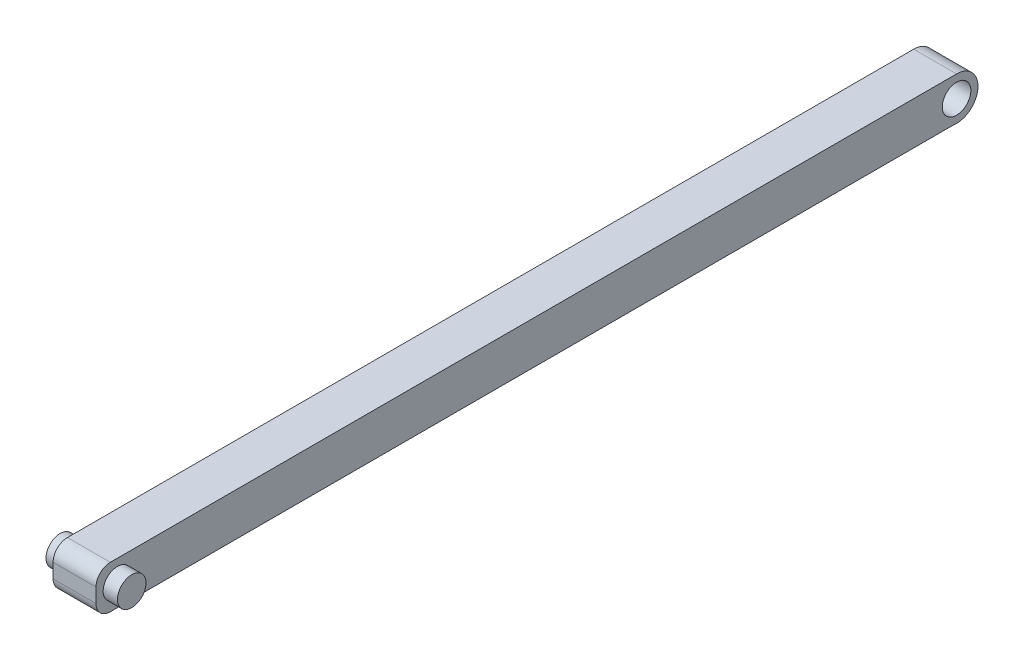
ISO-10303-21;
HEADER;
FILE_DESCRIPTION(('STEP AP214'),'2;1');
FILE_NAME('part.step','',(''),(''),'','','');
FILE_SCHEMA(('AUTOMOTIVE_DESIGN { 1 0 10303 214 1 1 1 1 }'));
ENDSEC;
DATA;
#1=APPLICATION_CONTEXT('core data for automotive mechanical design processes');
#2=APPLICATION_PROTOCOL_DEFINITION('international standard','automotive_design',2000,#1);
#3=PRODUCT_CONTEXT('',#1,'mechanical');
#4=PRODUCT('Part','Part','',(#3));
#5=PRODUCT_RELATED_PRODUCT_CATEGORY('part','',(#4));
#6=PRODUCT_DEFINITION_FORMATION('','',#4);
#7=PRODUCT_DEFINITION_CONTEXT('part definition',#1,'design');
#8=PRODUCT_DEFINITION('design','',#6,#7);
#9=PRODUCT_DEFINITION_SHAPE('','',#8);
#10=(LENGTH_UNIT() NAMED_UNIT(*) SI_UNIT(.MILLI.,.METRE.));
#11=(NAMED_UNIT(*) PLANE_ANGLE_UNIT() SI_UNIT($,.RADIAN.));
#12=(NAMED_UNIT(*) SI_UNIT($,.STERADIAN.) SOLID_ANGLE_UNIT());
#13=UNCERTAINTY_MEASURE_WITH_UNIT(LENGTH_MEASURE(1.E-05),#10,'distance_accuracy_value','');
#14=(GEOMETRIC_REPRESENTATION_CONTEXT(3) GLOBAL_UNCERTAINTY_ASSIGNED_CONTEXT((#13)) GLOBAL_UNIT_ASSIGNED_CONTEXT((#10,
#11,#12)) REPRESENTATION_CONTEXT('',''));
#15=CARTESIAN_POINT('',(0.,0.,0.));
#16=DIRECTION('',(0.,0.,1.));
#17=DIRECTION('',(1.,0.,0.));
#18=AXIS2_PLACEMENT_3D('',#15,#16,#17);
#19=CARTESIAN_POINT('',(15.,0.,-100.));
#20=DIRECTION('',(1.,0.,0.));
#21=DIRECTION('',(0.,0.,-1.));
#22=AXIS2_PLACEMENT_3D('',#19,#20,#21);
#23=PLANE('',#22);
#24=CARTESIAN_POINT('',(15.,0.0669810012814782,193.509068176166));
#25=DIRECTION('',(1.,0.,0.));
#26=DIRECTION('',(0.,0.,-1.));
#27=AXIS2_PLACEMENT_3D('',#24,#25,#26);
#28=CIRCLE('',#27,4.99999999999999);
#29=CARTESIAN_POINT('',(15.,0.0669810012814782,188.509068176166));
#30=VERTEX_POINT('',#29);
#31=EDGE_CURVE('E114',#30,#30,#28,.T.);
#32=ORIENTED_EDGE('',*,*,#31,.F.);
#33=EDGE_LOOP('',(#32));
#34=FACE_BOUND('',#33,.T.);
#35=DIRECTION('',(0.,-1.,0.));
#36=VECTOR('',#35,1.);
#37=CARTESIAN_POINT('',(15.,7.56869275860022,201.009068176166));
#38=LINE('',#37,#36);
#39=CARTESIAN_POINT('',(15.,2.56755158705439,201.009068176166));
#40=VERTEX_POINT('',#39);
#41=CARTESIAN_POINT('',(15.,-2.43131560000225,201.009068176166));
#42=VERTEX_POINT('',#41);
#43=EDGE_CURVE('E104',#40,#42,#38,.T.);
#44=ORIENTED_EDGE('',*,*,#43,.T.);
#45=CARTESIAN_POINT('',(15.,-2.43131560000225,196.009068176166));
#46=DIRECTION('',(1.,0.,0.));
#47=DIRECTION('',(0.,0.,-1.));
#48=AXIS2_PLACEMENT_3D('',#45,#46,#47);
#49=CIRCLE('',#48,5.);
#50=CARTESIAN_POINT('',(15.,-7.43131559999526,196.009076534776));
#51=VERTEX_POINT('',#50);
#52=EDGE_CURVE('E47',#42,#51,#49,.T.);
#53=ORIENTED_EDGE('',*,*,#52,.T.);
#54=DIRECTION('',(0.,-1.67172189245492E-06,-0.999999999998603));
#55=VECTOR('',#54,1.);
#56=CARTESIAN_POINT('',(15.,-7.43130724139978,201.009068176166));
#57=LINE('',#56,#55);
#58=CARTESIAN_POINT('',(15.,-7.43180875796751,-98.9909318234146));
#59=VERTEX_POINT('',#58);
#60=EDGE_CURVE('E93',#51,#59,#57,.T.);
#61=ORIENTED_EDGE('',*,*,#60,.T.);
#62=CARTESIAN_POINT('',(15.,0.,-100.));
#63=DIRECTION('',(1.,0.,0.));
#64=DIRECTION('',(0.,0.,-1.));
#65=AXIS2_PLACEMENT_3D('',#62,#63,#64);
#66=CIRCLE('',#65,7.5);
#67=CARTESIAN_POINT('',(15.,7.5,-100.));
#68=VERTEX_POINT('',#67);
#69=EDGE_CURVE('E97',#59,#68,#66,.T.);
#70=ORIENTED_EDGE('',*,*,#69,.T.);
#71=DIRECTION('',(0.,0.000228208263716815,0.999999973960494));
#72=VECTOR('',#71,1.);
#73=CARTESIAN_POINT('',(15.,7.56869275860022,201.009068176166));
#74=LINE('',#73,#72);
#75=CARTESIAN_POINT('',(15.,7.56755145685686,196.007927134848));
#76=VERTEX_POINT('',#75);
#77=EDGE_CURVE('E120',#68,#76,#74,.T.);
#78=ORIENTED_EDGE('',*,*,#77,.T.);
#79=CARTESIAN_POINT('',(15.,2.56755158705439,196.009068176166));
#80=DIRECTION('',(1.,0.,0.));
#81=DIRECTION('',(0.,0.,-1.));
#82=AXIS2_PLACEMENT_3D('',#79,#80,#81);
#83=CIRCLE('',#82,5.);
#84=EDGE_CURVE('E161',#76,#40,#83,.T.);
#85=ORIENTED_EDGE('',*,*,#84,.T.);
#86=EDGE_LOOP('',(#44,#53,#61,#70,#78,#85));
#87=FACE_BOUND('',#86,.T.);
#88=CARTESIAN_POINT('',(15.,0.,-100.));
#89=DIRECTION('',(1.,0.,0.));
#90=DIRECTION('',(0.,0.,-1.));
#91=AXIS2_PLACEMENT_3D('',#88,#89,#90);
#92=CIRCLE('',#91,5.);
#93=CARTESIAN_POINT('',(15.,0.,-105.));
#94=VERTEX_POINT('',#93);
#95=EDGE_CURVE('E129',#94,#94,#92,.T.);
#96=ORIENTED_EDGE('',*,*,#95,.F.);
#97=EDGE_LOOP('',(#96));
#98=FACE_BOUND('',#97,.T.);
#99=ADVANCED_FACE('F38',(#34,#87,#98),#23,.T.);
#100=CARTESIAN_POINT('',(0.,0.,-100.));
#101=DIRECTION('',(1.,0.,0.));
#102=DIRECTION('',(0.,0.,-1.));
#103=AXIS2_PLACEMENT_3D('',#100,#101,#102);
#104=PLANE('',#103);
#105=CARTESIAN_POINT('',(0.,0.0669810012814782,193.509068176166));
#106=DIRECTION('',(1.,0.,0.));
#107=DIRECTION('',(0.,0.,-1.));
#108=AXIS2_PLACEMENT_3D('',#105,#106,#107);
#109=CIRCLE('',#108,4.99999999999999);
#110=CARTESIAN_POINT('',(0.,0.0669810012814782,188.509068176166));
#111=VERTEX_POINT('',#110);
#112=EDGE_CURVE('E140',#111,#111,#109,.T.);
#113=ORIENTED_EDGE('',*,*,#112,.T.);
#114=EDGE_LOOP('',(#113));
#115=FACE_BOUND('',#114,.T.);
#116=DIRECTION('',(0.,-1.67172189245492E-06,-0.999999999998603));
#117=VECTOR('',#116,1.);
#118=CARTESIAN_POINT('',(0.,-7.43130724139978,201.009068176166));
#119=LINE('',#118,#117);
#120=CARTESIAN_POINT('',(0.,-7.43131559999526,196.009076534776));
#121=VERTEX_POINT('',#120);
#122=CARTESIAN_POINT('',(0.,-7.43180875796751,-98.9909318234146));
#123=VERTEX_POINT('',#122);
#124=EDGE_CURVE('E110',#121,#123,#119,.T.);
#125=ORIENTED_EDGE('',*,*,#124,.F.);
#126=CARTESIAN_POINT('',(0.,-2.43131560000225,196.009068176166));
#127=DIRECTION('',(1.,0.,0.));
#128=DIRECTION('',(0.,0.,-1.));
#129=AXIS2_PLACEMENT_3D('',#126,#127,#128);
#130=CIRCLE('',#129,5.);
#131=CARTESIAN_POINT('',(0.,-2.43131560000225,201.009068176166));
#132=VERTEX_POINT('',#131);
#133=EDGE_CURVE('E152',#121,#132,#130,.F.);
#134=ORIENTED_EDGE('',*,*,#133,.T.);
#135=DIRECTION('',(0.,-1.,0.));
#136=VECTOR('',#135,1.);
#137=CARTESIAN_POINT('',(0.,7.56869275860022,201.009068176166));
#138=LINE('',#137,#136);
#139=CARTESIAN_POINT('',(0.,2.56755158705439,201.009068176166));
#140=VERTEX_POINT('',#139);
#141=EDGE_CURVE('E126',#140,#132,#138,.T.);
#142=ORIENTED_EDGE('',*,*,#141,.F.);
#143=CARTESIAN_POINT('',(0.,2.56755158705439,196.009068176166));
#144=DIRECTION('',(1.,0.,0.));
#145=DIRECTION('',(0.,0.,-1.));
#146=AXIS2_PLACEMENT_3D('',#143,#144,#145);
#147=CIRCLE('',#146,5.);
#148=CARTESIAN_POINT('',(0.,7.56755145685686,196.007927134848));
#149=VERTEX_POINT('',#148);
#150=EDGE_CURVE('E149',#140,#149,#147,.F.);
#151=ORIENTED_EDGE('',*,*,#150,.T.);
#152=DIRECTION('',(0.,0.000228208263716815,0.999999973960494));
#153=VECTOR('',#152,1.);
#154=CARTESIAN_POINT('',(0.,7.56869275860022,201.009068176166));
#155=LINE('',#154,#153);
#156=CARTESIAN_POINT('',(0.,7.5,-100.));
#157=VERTEX_POINT('',#156);
#158=EDGE_CURVE('E135',#157,#149,#155,.T.);
#159=ORIENTED_EDGE('',*,*,#158,.F.);
#160=CARTESIAN_POINT('',(0.,0.,-100.));
#161=DIRECTION('',(1.,0.,0.));
#162=DIRECTION('',(0.,0.,-1.));
#163=AXIS2_PLACEMENT_3D('',#160,#161,#162);
#164=CIRCLE('',#163,7.5);
#165=EDGE_CURVE('E132',#123,#157,#164,.T.);
#166=ORIENTED_EDGE('',*,*,#165,.F.);
#167=EDGE_LOOP('',(#125,#134,#142,#151,#159,#166));
#168=FACE_BOUND('',#167,.T.);
#169=CARTESIAN_POINT('',(0.,0.,-100.));
#170=DIRECTION('',(1.,0.,0.));
#171=DIRECTION('',(0.,0.,-1.));
#172=AXIS2_PLACEMENT_3D('',#169,#170,#171);
#173=CIRCLE('',#172,5.);
#174=CARTESIAN_POINT('',(0.,0.,-105.));
#175=VERTEX_POINT('',#174);
#176=EDGE_CURVE('E144',#175,#175,#173,.T.);
#177=ORIENTED_EDGE('',*,*,#176,.T.);
#178=EDGE_LOOP('',(#177));
#179=FACE_BOUND('',#178,.T.);
#180=ADVANCED_FACE('F183',(#115,#168,#179),#104,.F.);
#181=CARTESIAN_POINT('',(15.,7.56869275860022,201.009068176166));
#182=DIRECTION('',(0.,0.,-1.));
#183=DIRECTION('',(-1.,0.,0.));
#184=AXIS2_PLACEMENT_3D('',#181,#182,#183);
#185=PLANE('',#184);
#186=ORIENTED_EDGE('',*,*,#141,.T.);
#187=DIRECTION('',(-1.,0.,0.));
#188=VECTOR('',#187,1.);
#189=CARTESIAN_POINT('',(15.,-2.43131560000225,201.009068176166));
#190=LINE('',#189,#188);
#191=EDGE_CURVE('E60',#132,#42,#190,.F.);
#192=ORIENTED_EDGE('',*,*,#191,.T.);
#193=ORIENTED_EDGE('',*,*,#43,.F.);
#194=DIRECTION('',(-1.,0.,0.));
#195=VECTOR('',#194,1.);
#196=CARTESIAN_POINT('',(15.,2.56755158705439,201.009068176166));
#197=LINE('',#196,#195);
#198=EDGE_CURVE('E155',#40,#140,#197,.T.);
#199=ORIENTED_EDGE('',*,*,#198,.T.);
#200=EDGE_LOOP('',(#186,#192,#193,#199));
#201=FACE_BOUND('',#200,.T.);
#202=ADVANCED_FACE('F189',(#201),#185,.F.);
#203=CARTESIAN_POINT('',(15.,-7.43130724139978,201.009068176166));
#204=DIRECTION('',(0.,0.999999999998603,-1.67172189245492E-06));
#205=DIRECTION('',(0.,1.67172189245492E-06,0.999999999998603));
#206=AXIS2_PLACEMENT_3D('',#203,#204,#205);
#207=PLANE('',#206);
#208=ORIENTED_EDGE('',*,*,#60,.F.);
#209=DIRECTION('',(-1.,0.,0.));
#210=VECTOR('',#209,1.);
#211=CARTESIAN_POINT('',(15.,-7.43131559999526,196.009076534776));
#212=LINE('',#211,#210);
#213=EDGE_CURVE('E146',#51,#121,#212,.T.);
#214=ORIENTED_EDGE('',*,*,#213,.T.);
#215=ORIENTED_EDGE('',*,*,#124,.T.);
#216=DIRECTION('',(-1.,0.,0.));
#217=VECTOR('',#216,1.);
#218=CARTESIAN_POINT('',(15.,-7.43180875796751,-98.9909318234146));
#219=LINE('',#218,#217);
#220=EDGE_CURVE('E107',#59,#123,#219,.T.);
#221=ORIENTED_EDGE('',*,*,#220,.F.);
#222=EDGE_LOOP('',(#208,#214,#215,#221));
#223=FACE_BOUND('',#222,.T.);
#224=ADVANCED_FACE('F108',(#223),#207,.F.);
#225=CARTESIAN_POINT('',(15.,0.,-100.));
#226=DIRECTION('',(-1.,0.,0.));
#227=DIRECTION('',(0.,0.,1.));
#228=AXIS2_PLACEMENT_3D('',#225,#226,#227);
#229=CYLINDRICAL_SURFACE('',#228,7.5);
#230=ORIENTED_EDGE('',*,*,#165,.T.);
#231=DIRECTION('',(-1.,0.,0.));
#232=VECTOR('',#231,1.);
#233=CARTESIAN_POINT('',(15.,7.5,-100.));
#234=LINE('',#233,#232);
#235=EDGE_CURVE('E115',#68,#157,#234,.T.);
#236=ORIENTED_EDGE('',*,*,#235,.F.);
#237=ORIENTED_EDGE('',*,*,#69,.F.);
#238=ORIENTED_EDGE('',*,*,#220,.T.);
#239=EDGE_LOOP('',(#230,#236,#237,#238));
#240=FACE_BOUND('',#239,.T.);
#241=ADVANCED_FACE('F117',(#240),#229,.T.);
#242=CARTESIAN_POINT('',(15.,7.56869275860022,201.009068176166));
#243=DIRECTION('',(0.,-0.999999973960494,0.000228208263716815));
#244=DIRECTION('',(0.,-0.000228208263716815,-0.999999973960494));
#245=AXIS2_PLACEMENT_3D('',#242,#243,#244);
#246=PLANE('',#245);
#247=ORIENTED_EDGE('',*,*,#158,.T.);
#248=DIRECTION('',(-1.,0.,0.));
#249=VECTOR('',#248,1.);
#250=CARTESIAN_POINT('',(15.,7.56755145685686,196.007927134848));
#251=LINE('',#250,#249);
#252=EDGE_CURVE('E11',#149,#76,#251,.F.);
#253=ORIENTED_EDGE('',*,*,#252,.T.);
#254=ORIENTED_EDGE('',*,*,#77,.F.);
#255=ORIENTED_EDGE('',*,*,#235,.T.);
#256=EDGE_LOOP('',(#247,#253,#254,#255));
#257=FACE_BOUND('',#256,.T.);
#258=ADVANCED_FACE('F187',(#257),#246,.F.);
#259=CARTESIAN_POINT('',(15.,0.,-100.));
#260=DIRECTION('',(-1.,0.,0.));
#261=DIRECTION('',(0.,0.,1.));
#262=AXIS2_PLACEMENT_3D('',#259,#260,#261);
#263=CYLINDRICAL_SURFACE('',#262,5.);
#264=ORIENTED_EDGE('',*,*,#95,.T.);
#265=EDGE_LOOP('',(#264));
#266=FACE_BOUND('',#265,.T.);
#267=ORIENTED_EDGE('',*,*,#176,.F.);
#268=EDGE_LOOP('',(#267));
#269=FACE_BOUND('',#268,.T.);
#270=ADVANCED_FACE('F206',(#266,#269),#263,.F.);
#271=CARTESIAN_POINT('',(-5.,0.0669810012814782,193.509068176166));
#272=DIRECTION('',(1.,0.,0.));
#273=DIRECTION('',(0.,0.,-1.));
#274=AXIS2_PLACEMENT_3D('',#271,#272,#273);
#275=PLANE('',#274);
#276=CARTESIAN_POINT('',(-5.,0.0669810012814782,193.509068176166));
#277=DIRECTION('',(1.,0.,0.));
#278=DIRECTION('',(0.,0.,-1.));
#279=AXIS2_PLACEMENT_3D('',#276,#277,#278);
#280=CIRCLE('',#279,4.99999999999999);
#281=CARTESIAN_POINT('',(-5.,0.0669810012814782,188.509068176166));
#282=VERTEX_POINT('',#281);
#283=EDGE_CURVE('E145',#282,#282,#280,.T.);
#284=ORIENTED_EDGE('',*,*,#283,.F.);
#285=EDGE_LOOP('',(#284));
#286=FACE_BOUND('',#285,.T.);
#287=ADVANCED_FACE('F231',(#286),#275,.F.);
#288=CARTESIAN_POINT('',(-5.,0.0669810012814782,193.509068176166));
#289=DIRECTION('',(1.,0.,0.));
#290=DIRECTION('',(0.,0.,-1.));
#291=AXIS2_PLACEMENT_3D('',#288,#289,#290);
#292=CYLINDRICAL_SURFACE('',#291,4.99999999999999);
#293=ORIENTED_EDGE('',*,*,#283,.T.);
#294=EDGE_LOOP('',(#293));
#295=FACE_BOUND('',#294,.T.);
#296=ORIENTED_EDGE('',*,*,#112,.F.);
#297=EDGE_LOOP('',(#296));
#298=FACE_BOUND('',#297,.T.);
#299=ADVANCED_FACE('F237',(#295,#298),#292,.T.);
#300=ORIENTED_EDGE('',*,*,#31,.T.);
#301=EDGE_LOOP('',(#300));
#302=FACE_BOUND('',#301,.T.);
#303=CARTESIAN_POINT('',(20.,0.0669810012814782,193.509068176166));
#304=DIRECTION('',(1.,0.,0.));
#305=DIRECTION('',(0.,0.,-1.));
#306=AXIS2_PLACEMENT_3D('',#303,#304,#305);
#307=CIRCLE('',#306,4.99999999999999);
#308=CARTESIAN_POINT('',(20.,0.0669810012814782,188.509068176166));
#309=VERTEX_POINT('',#308);
#310=EDGE_CURVE('E285',#309,#309,#307,.T.);
#311=ORIENTED_EDGE('',*,*,#310,.F.);
#312=EDGE_LOOP('',(#311));
#313=FACE_BOUND('',#312,.T.);
#314=ADVANCED_FACE('F245',(#302,#313),#292,.T.);
#315=CARTESIAN_POINT('',(20.,0.0669810012814782,193.509068176166));
#316=DIRECTION('',(1.,0.,0.));
#317=DIRECTION('',(0.,0.,-1.));
#318=AXIS2_PLACEMENT_3D('',#315,#316,#317);
#319=PLANE('',#318);
#320=ORIENTED_EDGE('',*,*,#310,.T.);
#321=EDGE_LOOP('',(#320));
#322=FACE_BOUND('',#321,.T.);
#323=ADVANCED_FACE('F252',(#322),#319,.T.);
#324=CARTESIAN_POINT('',(15.,-2.43131560000225,196.009068176166));
#325=DIRECTION('',(-1.,0.,0.));
#326=DIRECTION('',(0.,0.,1.));
#327=AXIS2_PLACEMENT_3D('',#324,#325,#326);
#328=CYLINDRICAL_SURFACE('',#327,5.);
#329=ORIENTED_EDGE('',*,*,#52,.F.);
#330=ORIENTED_EDGE('',*,*,#191,.F.);
#331=ORIENTED_EDGE('',*,*,#133,.F.);
#332=ORIENTED_EDGE('',*,*,#213,.F.);
#333=EDGE_LOOP('',(#329,#330,#331,#332));
#334=FACE_BOUND('',#333,.T.);
#335=ADVANCED_FACE('F181',(#334),#328,.T.);
#336=CARTESIAN_POINT('',(15.,2.56755158705439,196.009068176166));
#337=DIRECTION('',(-1.,0.,0.));
#338=DIRECTION('',(0.,0.,1.));
#339=AXIS2_PLACEMENT_3D('',#336,#337,#338);
#340=CYLINDRICAL_SURFACE('',#339,5.);
#341=ORIENTED_EDGE('',*,*,#84,.F.);
#342=ORIENTED_EDGE('',*,*,#252,.F.);
#343=ORIENTED_EDGE('',*,*,#150,.F.);
#344=ORIENTED_EDGE('',*,*,#198,.F.);
#345=EDGE_LOOP('',(#341,#342,#343,#344));
#346=FACE_BOUND('',#345,.T.);
#347=ADVANCED_FACE('F40',(#346),#340,.T.);
#348=CLOSED_SHELL('',(#99,#180,#202,#224,#241,#258,#270,#287,#299,#314,#323,#335,#347));
#349=MANIFOLD_SOLID_BREP('B2',#348);
#350=ADVANCED_BREP_SHAPE_REPRESENTATION('',(#18,#349),#14);
#351=SHAPE_DEFINITION_REPRESENTATION(#9,#350);
ENDSEC;
END-ISO-10303-21;
